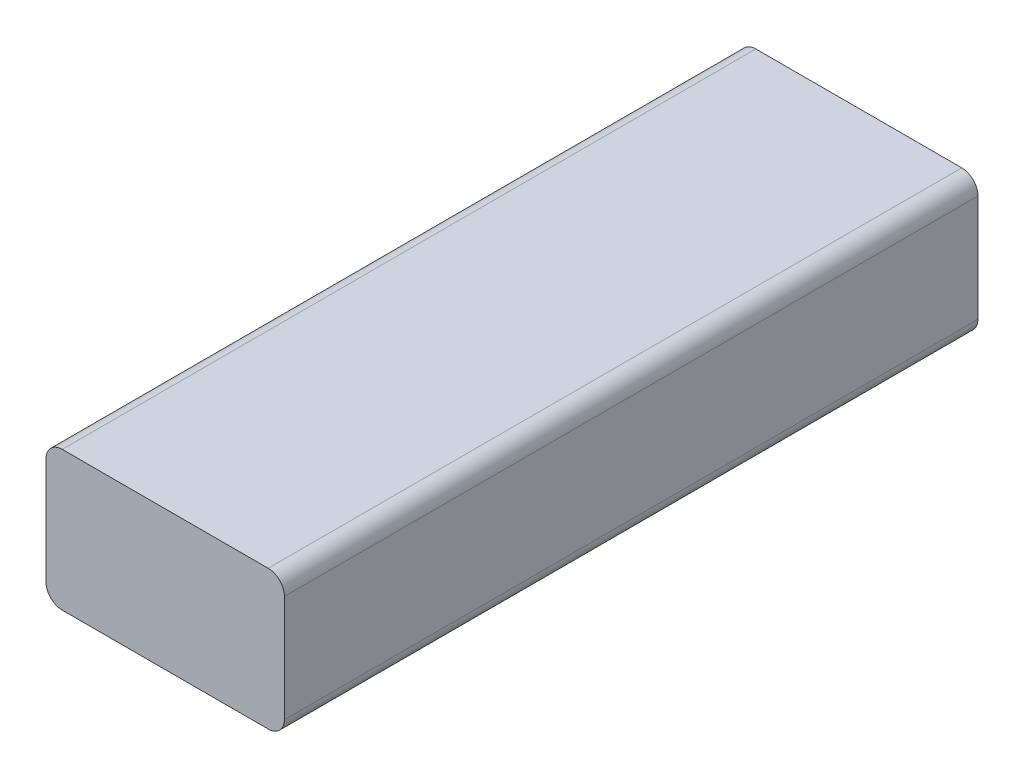
ISO-10303-21;
HEADER;
FILE_DESCRIPTION(('STEP AP214'),'2;1');
FILE_NAME('part.step','',(''),(''),'','','');
FILE_SCHEMA(('AUTOMOTIVE_DESIGN { 1 0 10303 214 1 1 1 1 }'));
ENDSEC;
DATA;
#1=APPLICATION_CONTEXT('core data for automotive mechanical design processes');
#2=APPLICATION_PROTOCOL_DEFINITION('international standard','automotive_design',2000,#1);
#3=PRODUCT_CONTEXT('',#1,'mechanical');
#4=PRODUCT('Part','Part','',(#3));
#5=PRODUCT_RELATED_PRODUCT_CATEGORY('part','',(#4));
#6=PRODUCT_DEFINITION_FORMATION('','',#4);
#7=PRODUCT_DEFINITION_CONTEXT('part definition',#1,'design');
#8=PRODUCT_DEFINITION('design','',#6,#7);
#9=PRODUCT_DEFINITION_SHAPE('','',#8);
#10=(LENGTH_UNIT() NAMED_UNIT(*) SI_UNIT(.MILLI.,.METRE.));
#11=(NAMED_UNIT(*) PLANE_ANGLE_UNIT() SI_UNIT($,.RADIAN.));
#12=(NAMED_UNIT(*) SI_UNIT($,.STERADIAN.) SOLID_ANGLE_UNIT());
#13=UNCERTAINTY_MEASURE_WITH_UNIT(LENGTH_MEASURE(1.E-05),#10,'distance_accuracy_value','');
#14=(GEOMETRIC_REPRESENTATION_CONTEXT(3) GLOBAL_UNCERTAINTY_ASSIGNED_CONTEXT((#13)) GLOBAL_UNIT_ASSIGNED_CONTEXT((#10,
#11,#12)) REPRESENTATION_CONTEXT('',''));
#15=CARTESIAN_POINT('',(0.,0.,0.));
#16=DIRECTION('',(0.,0.,1.));
#17=DIRECTION('',(1.,0.,0.));
#18=AXIS2_PLACEMENT_3D('',#15,#16,#17);
#19=CARTESIAN_POINT('',(-19.,-9.85,64.));
#20=DIRECTION('',(0.,0.,-1.));
#21=DIRECTION('',(-1.,0.,0.));
#22=AXIS2_PLACEMENT_3D('',#19,#20,#21);
#23=CYLINDRICAL_SURFACE('',#22,3.);
#24=CARTESIAN_POINT('',(-19.,-9.85,-64.));
#25=DIRECTION('',(0.,0.,1.));
#26=DIRECTION('',(1.,0.,0.));
#27=AXIS2_PLACEMENT_3D('',#24,#25,#26);
#28=CIRCLE('',#27,3.);
#29=CARTESIAN_POINT('',(-22.,-9.85,-64.));
#30=VERTEX_POINT('',#29);
#31=CARTESIAN_POINT('',(-19.,-12.85,-64.));
#32=VERTEX_POINT('',#31);
#33=EDGE_CURVE('E130',#30,#32,#28,.T.);
#34=ORIENTED_EDGE('',*,*,#33,.T.);
#35=DIRECTION('',(0.,0.,-1.));
#36=VECTOR('',#35,1.);
#37=CARTESIAN_POINT('',(-19.,-12.85,64.));
#38=LINE('',#37,#36);
#39=CARTESIAN_POINT('',(-19.,-12.85,64.));
#40=VERTEX_POINT('',#39);
#41=EDGE_CURVE('E11',#40,#32,#38,.T.);
#42=ORIENTED_EDGE('',*,*,#41,.F.);
#43=CARTESIAN_POINT('',(-19.,-9.85,64.));
#44=DIRECTION('',(0.,0.,1.));
#45=DIRECTION('',(1.,0.,0.));
#46=AXIS2_PLACEMENT_3D('',#43,#44,#45);
#47=CIRCLE('',#46,3.);
#48=CARTESIAN_POINT('',(-22.,-9.85,64.));
#49=VERTEX_POINT('',#48);
#50=EDGE_CURVE('E144',#49,#40,#47,.T.);
#51=ORIENTED_EDGE('',*,*,#50,.F.);
#52=DIRECTION('',(0.,0.,-1.));
#53=VECTOR('',#52,1.);
#54=CARTESIAN_POINT('',(-22.,-9.85,64.));
#55=LINE('',#54,#53);
#56=EDGE_CURVE('E126',#49,#30,#55,.T.);
#57=ORIENTED_EDGE('',*,*,#56,.T.);
#58=EDGE_LOOP('',(#34,#42,#51,#57));
#59=FACE_BOUND('',#58,.T.);
#60=ADVANCED_FACE('F34',(#59),#23,.T.);
#61=CARTESIAN_POINT('',(-19.,-12.85,64.));
#62=DIRECTION('',(0.,1.,0.));
#63=DIRECTION('',(0.,0.,1.));
#64=AXIS2_PLACEMENT_3D('',#61,#62,#63);
#65=PLANE('',#64);
#66=DIRECTION('',(1.,0.,0.));
#67=VECTOR('',#66,1.);
#68=CARTESIAN_POINT('',(-19.,-12.85,-64.));
#69=LINE('',#68,#67);
#70=CARTESIAN_POINT('',(19.,-12.85,-64.));
#71=VERTEX_POINT('',#70);
#72=EDGE_CURVE('E133',#32,#71,#69,.T.);
#73=ORIENTED_EDGE('',*,*,#72,.T.);
#74=DIRECTION('',(0.,0.,-1.));
#75=VECTOR('',#74,1.);
#76=CARTESIAN_POINT('',(19.,-12.85,64.));
#77=LINE('',#76,#75);
#78=CARTESIAN_POINT('',(19.,-12.85,64.));
#79=VERTEX_POINT('',#78);
#80=EDGE_CURVE('E42',#79,#71,#77,.T.);
#81=ORIENTED_EDGE('',*,*,#80,.F.);
#82=DIRECTION('',(1.,0.,0.));
#83=VECTOR('',#82,1.);
#84=CARTESIAN_POINT('',(-19.,-12.85,64.));
#85=LINE('',#84,#83);
#86=EDGE_CURVE('E93',#40,#79,#85,.T.);
#87=ORIENTED_EDGE('',*,*,#86,.F.);
#88=ORIENTED_EDGE('',*,*,#41,.T.);
#89=EDGE_LOOP('',(#73,#81,#87,#88));
#90=FACE_BOUND('',#89,.T.);
#91=ADVANCED_FACE('F179',(#90),#65,.F.);
#92=CARTESIAN_POINT('',(19.,-9.85,64.));
#93=DIRECTION('',(0.,0.,-1.));
#94=DIRECTION('',(-1.,0.,0.));
#95=AXIS2_PLACEMENT_3D('',#92,#93,#94);
#96=CYLINDRICAL_SURFACE('',#95,3.);
#97=CARTESIAN_POINT('',(19.,-9.85,-64.));
#98=DIRECTION('',(0.,0.,1.));
#99=DIRECTION('',(1.,0.,0.));
#100=AXIS2_PLACEMENT_3D('',#97,#98,#99);
#101=CIRCLE('',#100,3.);
#102=CARTESIAN_POINT('',(22.,-9.85,-64.));
#103=VERTEX_POINT('',#102);
#104=EDGE_CURVE('E135',#71,#103,#101,.T.);
#105=ORIENTED_EDGE('',*,*,#104,.T.);
#106=DIRECTION('',(0.,0.,-1.));
#107=VECTOR('',#106,1.);
#108=CARTESIAN_POINT('',(22.,-9.85,64.));
#109=LINE('',#108,#107);
#110=CARTESIAN_POINT('',(22.,-9.85,64.));
#111=VERTEX_POINT('',#110);
#112=EDGE_CURVE('E151',#111,#103,#109,.T.);
#113=ORIENTED_EDGE('',*,*,#112,.F.);
#114=CARTESIAN_POINT('',(19.,-9.85,64.));
#115=DIRECTION('',(0.,0.,1.));
#116=DIRECTION('',(1.,0.,0.));
#117=AXIS2_PLACEMENT_3D('',#114,#115,#116);
#118=CIRCLE('',#117,3.);
#119=EDGE_CURVE('E159',#79,#111,#118,.T.);
#120=ORIENTED_EDGE('',*,*,#119,.F.);
#121=ORIENTED_EDGE('',*,*,#80,.T.);
#122=EDGE_LOOP('',(#105,#113,#120,#121));
#123=FACE_BOUND('',#122,.T.);
#124=ADVANCED_FACE('F157',(#123),#96,.T.);
#125=CARTESIAN_POINT('',(22.,-9.85,64.));
#126=DIRECTION('',(-1.,0.,0.));
#127=DIRECTION('',(0.,0.,1.));
#128=AXIS2_PLACEMENT_3D('',#125,#126,#127);
#129=PLANE('',#128);
#130=DIRECTION('',(0.,1.,0.));
#131=VECTOR('',#130,1.);
#132=CARTESIAN_POINT('',(22.,-9.85,-64.));
#133=LINE('',#132,#131);
#134=CARTESIAN_POINT('',(22.,9.85,-64.));
#135=VERTEX_POINT('',#134);
#136=EDGE_CURVE('E137',#103,#135,#133,.T.);
#137=ORIENTED_EDGE('',*,*,#136,.T.);
#138=DIRECTION('',(0.,0.,-1.));
#139=VECTOR('',#138,1.);
#140=CARTESIAN_POINT('',(22.,9.85,64.));
#141=LINE('',#140,#139);
#142=CARTESIAN_POINT('',(22.,9.85,64.));
#143=VERTEX_POINT('',#142);
#144=EDGE_CURVE('E148',#143,#135,#141,.T.);
#145=ORIENTED_EDGE('',*,*,#144,.F.);
#146=DIRECTION('',(0.,1.,0.));
#147=VECTOR('',#146,1.);
#148=CARTESIAN_POINT('',(22.,-9.85,64.));
#149=LINE('',#148,#147);
#150=EDGE_CURVE('E171',#111,#143,#149,.T.);
#151=ORIENTED_EDGE('',*,*,#150,.F.);
#152=ORIENTED_EDGE('',*,*,#112,.T.);
#153=EDGE_LOOP('',(#137,#145,#151,#152));
#154=FACE_BOUND('',#153,.T.);
#155=ADVANCED_FACE('F167',(#154),#129,.F.);
#156=CARTESIAN_POINT('',(19.,9.85,64.));
#157=DIRECTION('',(0.,0.,-1.));
#158=DIRECTION('',(-1.,0.,0.));
#159=AXIS2_PLACEMENT_3D('',#156,#157,#158);
#160=CYLINDRICAL_SURFACE('',#159,3.);
#161=CARTESIAN_POINT('',(19.,9.85,-64.));
#162=DIRECTION('',(0.,0.,1.));
#163=DIRECTION('',(1.,0.,0.));
#164=AXIS2_PLACEMENT_3D('',#161,#162,#163);
#165=CIRCLE('',#164,3.);
#166=CARTESIAN_POINT('',(19.,12.85,-64.));
#167=VERTEX_POINT('',#166);
#168=EDGE_CURVE('E139',#135,#167,#165,.T.);
#169=ORIENTED_EDGE('',*,*,#168,.T.);
#170=DIRECTION('',(0.,0.,-1.));
#171=VECTOR('',#170,1.);
#172=CARTESIAN_POINT('',(19.,12.85,64.));
#173=LINE('',#172,#171);
#174=CARTESIAN_POINT('',(19.,12.85,64.));
#175=VERTEX_POINT('',#174);
#176=EDGE_CURVE('E121',#175,#167,#173,.T.);
#177=ORIENTED_EDGE('',*,*,#176,.F.);
#178=CARTESIAN_POINT('',(19.,9.85,64.));
#179=DIRECTION('',(0.,0.,1.));
#180=DIRECTION('',(1.,0.,0.));
#181=AXIS2_PLACEMENT_3D('',#178,#179,#180);
#182=CIRCLE('',#181,3.);
#183=EDGE_CURVE('E112',#143,#175,#182,.T.);
#184=ORIENTED_EDGE('',*,*,#183,.F.);
#185=ORIENTED_EDGE('',*,*,#144,.T.);
#186=EDGE_LOOP('',(#169,#177,#184,#185));
#187=FACE_BOUND('',#186,.T.);
#188=ADVANCED_FACE('F170',(#187),#160,.T.);
#189=CARTESIAN_POINT('',(-19.,12.85,64.));
#190=DIRECTION('',(0.,-1.,0.));
#191=DIRECTION('',(0.,0.,-1.));
#192=AXIS2_PLACEMENT_3D('',#189,#190,#191);
#193=PLANE('',#192);
#194=DIRECTION('',(-1.,0.,0.));
#195=VECTOR('',#194,1.);
#196=CARTESIAN_POINT('',(-19.,12.85,-64.));
#197=LINE('',#196,#195);
#198=CARTESIAN_POINT('',(-19.,12.85,-64.));
#199=VERTEX_POINT('',#198);
#200=EDGE_CURVE('E120',#167,#199,#197,.T.);
#201=ORIENTED_EDGE('',*,*,#200,.T.);
#202=DIRECTION('',(0.,0.,-1.));
#203=VECTOR('',#202,1.);
#204=CARTESIAN_POINT('',(-19.,12.85,64.));
#205=LINE('',#204,#203);
#206=CARTESIAN_POINT('',(-19.,12.85,64.));
#207=VERTEX_POINT('',#206);
#208=EDGE_CURVE('E117',#207,#199,#205,.T.);
#209=ORIENTED_EDGE('',*,*,#208,.F.);
#210=DIRECTION('',(-1.,0.,0.));
#211=VECTOR('',#210,1.);
#212=CARTESIAN_POINT('',(-19.,12.85,64.));
#213=LINE('',#212,#211);
#214=EDGE_CURVE('E106',#175,#207,#213,.T.);
#215=ORIENTED_EDGE('',*,*,#214,.F.);
#216=ORIENTED_EDGE('',*,*,#176,.T.);
#217=EDGE_LOOP('',(#201,#209,#215,#216));
#218=FACE_BOUND('',#217,.T.);
#219=ADVANCED_FACE('F118',(#218),#193,.F.);
#220=CARTESIAN_POINT('',(-19.,9.85,64.));
#221=DIRECTION('',(0.,0.,-1.));
#222=DIRECTION('',(-1.,0.,0.));
#223=AXIS2_PLACEMENT_3D('',#220,#221,#222);
#224=CYLINDRICAL_SURFACE('',#223,3.);
#225=CARTESIAN_POINT('',(-19.,9.85,-64.));
#226=DIRECTION('',(0.,0.,1.));
#227=DIRECTION('',(-1.,0.,0.));
#228=AXIS2_PLACEMENT_3D('',#225,#226,#227);
#229=CIRCLE('',#228,3.);
#230=CARTESIAN_POINT('',(-22.,9.85,-64.));
#231=VERTEX_POINT('',#230);
#232=EDGE_CURVE('E79',#199,#231,#229,.T.);
#233=ORIENTED_EDGE('',*,*,#232,.T.);
#234=DIRECTION('',(0.,0.,-1.));
#235=VECTOR('',#234,1.);
#236=CARTESIAN_POINT('',(-22.,9.85,64.));
#237=LINE('',#236,#235);
#238=CARTESIAN_POINT('',(-22.,9.85,64.));
#239=VERTEX_POINT('',#238);
#240=EDGE_CURVE('E122',#239,#231,#237,.T.);
#241=ORIENTED_EDGE('',*,*,#240,.F.);
#242=CARTESIAN_POINT('',(-19.,9.85,64.));
#243=DIRECTION('',(0.,0.,1.));
#244=DIRECTION('',(-1.,0.,0.));
#245=AXIS2_PLACEMENT_3D('',#242,#243,#244);
#246=CIRCLE('',#245,3.);
#247=EDGE_CURVE('E110',#207,#239,#246,.T.);
#248=ORIENTED_EDGE('',*,*,#247,.F.);
#249=ORIENTED_EDGE('',*,*,#208,.T.);
#250=EDGE_LOOP('',(#233,#241,#248,#249));
#251=FACE_BOUND('',#250,.T.);
#252=ADVANCED_FACE('F124',(#251),#224,.T.);
#253=CARTESIAN_POINT('',(-22.,-9.85,64.));
#254=DIRECTION('',(1.,0.,0.));
#255=DIRECTION('',(0.,0.,-1.));
#256=AXIS2_PLACEMENT_3D('',#253,#254,#255);
#257=PLANE('',#256);
#258=DIRECTION('',(0.,-1.,0.));
#259=VECTOR('',#258,1.);
#260=CARTESIAN_POINT('',(-22.,-9.85,-64.));
#261=LINE('',#260,#259);
#262=EDGE_CURVE('E85',#231,#30,#261,.T.);
#263=ORIENTED_EDGE('',*,*,#262,.T.);
#264=ORIENTED_EDGE('',*,*,#56,.F.);
#265=DIRECTION('',(0.,-1.,0.));
#266=VECTOR('',#265,1.);
#267=CARTESIAN_POINT('',(-22.,-9.85,64.));
#268=LINE('',#267,#266);
#269=EDGE_CURVE('E50',#239,#49,#268,.T.);
#270=ORIENTED_EDGE('',*,*,#269,.F.);
#271=ORIENTED_EDGE('',*,*,#240,.T.);
#272=EDGE_LOOP('',(#263,#264,#270,#271));
#273=FACE_BOUND('',#272,.T.);
#274=ADVANCED_FACE('F195',(#273),#257,.F.);
#275=CARTESIAN_POINT('',(-19.,-9.85,64.));
#276=DIRECTION('',(0.,0.,1.));
#277=DIRECTION('',(1.,0.,0.));
#278=AXIS2_PLACEMENT_3D('',#275,#276,#277);
#279=PLANE('',#278);
#280=ORIENTED_EDGE('',*,*,#50,.T.);
#281=ORIENTED_EDGE('',*,*,#86,.T.);
#282=ORIENTED_EDGE('',*,*,#119,.T.);
#283=ORIENTED_EDGE('',*,*,#150,.T.);
#284=ORIENTED_EDGE('',*,*,#183,.T.);
#285=ORIENTED_EDGE('',*,*,#214,.T.);
#286=ORIENTED_EDGE('',*,*,#247,.T.);
#287=ORIENTED_EDGE('',*,*,#269,.T.);
#288=EDGE_LOOP('',(#280,#281,#282,#283,#284,#285,#286,#287));
#289=FACE_BOUND('',#288,.T.);
#290=ADVANCED_FACE('F108',(#289),#279,.T.);
#291=CARTESIAN_POINT('',(-19.,-9.85,-64.));
#292=DIRECTION('',(0.,0.,1.));
#293=DIRECTION('',(1.,0.,0.));
#294=AXIS2_PLACEMENT_3D('',#291,#292,#293);
#295=PLANE('',#294);
#296=ORIENTED_EDGE('',*,*,#33,.F.);
#297=ORIENTED_EDGE('',*,*,#262,.F.);
#298=ORIENTED_EDGE('',*,*,#232,.F.);
#299=ORIENTED_EDGE('',*,*,#200,.F.);
#300=ORIENTED_EDGE('',*,*,#168,.F.);
#301=ORIENTED_EDGE('',*,*,#136,.F.);
#302=ORIENTED_EDGE('',*,*,#104,.F.);
#303=ORIENTED_EDGE('',*,*,#72,.F.);
#304=EDGE_LOOP('',(#296,#297,#298,#299,#300,#301,#302,#303));
#305=FACE_BOUND('',#304,.T.);
#306=ADVANCED_FACE('F163',(#305),#295,.F.);
#307=CLOSED_SHELL('',(#60,#91,#124,#155,#188,#219,#252,#274,#290,#306));
#308=MANIFOLD_SOLID_BREP('B2',#307);
#309=ADVANCED_BREP_SHAPE_REPRESENTATION('',(#18,#308),#14);
#310=SHAPE_DEFINITION_REPRESENTATION(#9,#309);
ENDSEC;
END-ISO-10303-21;
